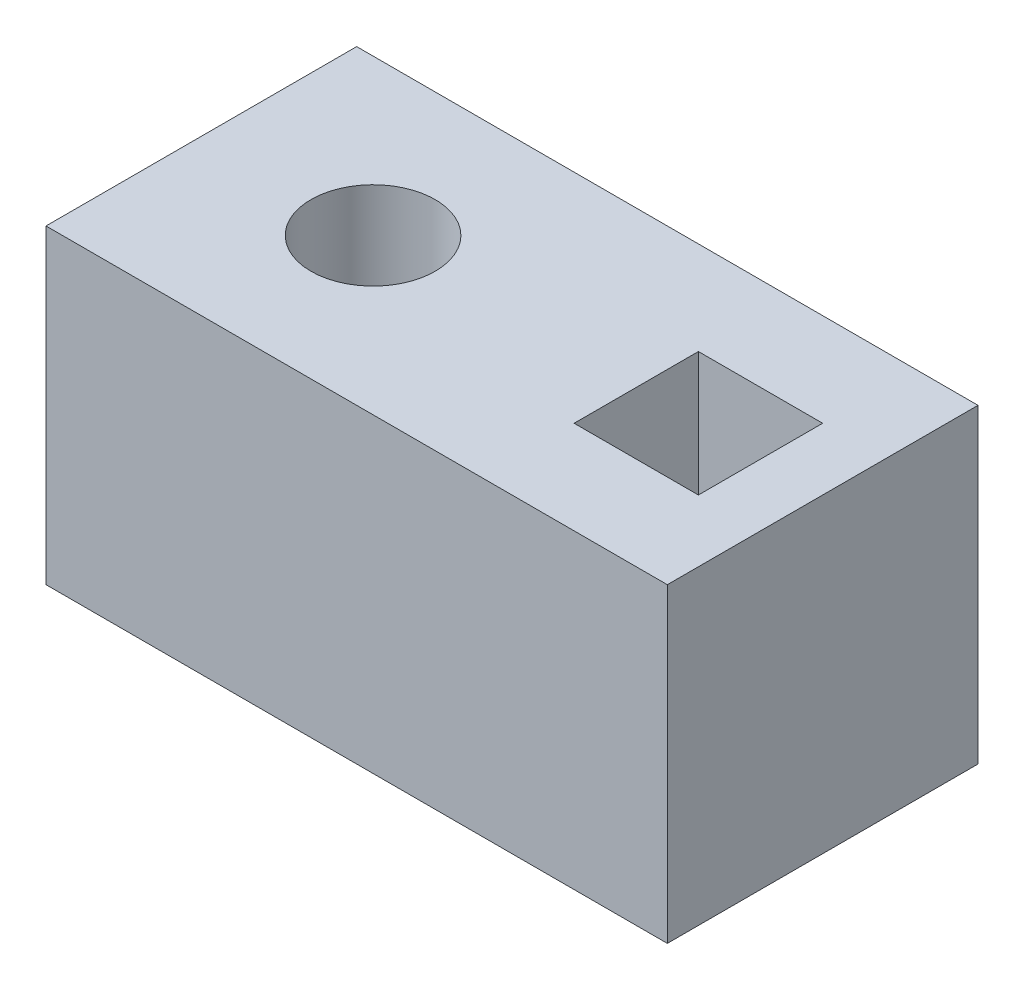
ISO-10303-21;
HEADER;
FILE_DESCRIPTION(('STEP AP214'),'2;1');
FILE_NAME('part.step','',(''),(''),'','','');
FILE_SCHEMA(('AUTOMOTIVE_DESIGN { 1 0 10303 214 1 1 1 1 }'));
ENDSEC;
DATA;
#1=APPLICATION_CONTEXT('core data for automotive mechanical design processes');
#2=APPLICATION_PROTOCOL_DEFINITION('international standard','automotive_design',2000,#1);
#3=PRODUCT_CONTEXT('',#1,'mechanical');
#4=PRODUCT('Part','Part','',(#3));
#5=PRODUCT_RELATED_PRODUCT_CATEGORY('part','',(#4));
#6=PRODUCT_DEFINITION_FORMATION('','',#4);
#7=PRODUCT_DEFINITION_CONTEXT('part definition',#1,'design');
#8=PRODUCT_DEFINITION('design','',#6,#7);
#9=PRODUCT_DEFINITION_SHAPE('','',#8);
#10=(LENGTH_UNIT() NAMED_UNIT(*) SI_UNIT(.MILLI.,.METRE.));
#11=(NAMED_UNIT(*) PLANE_ANGLE_UNIT() SI_UNIT($,.RADIAN.));
#12=(NAMED_UNIT(*) SI_UNIT($,.STERADIAN.) SOLID_ANGLE_UNIT());
#13=UNCERTAINTY_MEASURE_WITH_UNIT(LENGTH_MEASURE(1.E-05),#10,'distance_accuracy_value','');
#14=(GEOMETRIC_REPRESENTATION_CONTEXT(3) GLOBAL_UNCERTAINTY_ASSIGNED_CONTEXT((#13)) GLOBAL_UNIT_ASSIGNED_CONTEXT((#10,
#11,#12)) REPRESENTATION_CONTEXT('',''));
#15=CARTESIAN_POINT('',(0.,0.,0.));
#16=DIRECTION('',(0.,0.,1.));
#17=DIRECTION('',(1.,0.,0.));
#18=AXIS2_PLACEMENT_3D('',#15,#16,#17);
#19=CARTESIAN_POINT('',(0.,5.,0.));
#20=DIRECTION('',(0.,1.,0.));
#21=DIRECTION('',(0.,0.,1.));
#22=AXIS2_PLACEMENT_3D('',#19,#20,#21);
#23=PLANE('',#22);
#24=DIRECTION('',(0.,0.,1.));
#25=VECTOR('',#24,1.);
#26=CARTESIAN_POINT('',(-5.,5.,2.5));
#27=LINE('',#26,#25);
#28=CARTESIAN_POINT('',(-5.,5.,-2.5));
#29=VERTEX_POINT('',#28);
#30=CARTESIAN_POINT('',(-5.,5.,2.5));
#31=VERTEX_POINT('',#30);
#32=EDGE_CURVE('E161',#29,#31,#27,.T.);
#33=ORIENTED_EDGE('',*,*,#32,.T.);
#34=DIRECTION('',(1.,0.,0.));
#35=VECTOR('',#34,1.);
#36=CARTESIAN_POINT('',(5.,5.,2.5));
#37=LINE('',#36,#35);
#38=CARTESIAN_POINT('',(5.,5.,2.5));
#39=VERTEX_POINT('',#38);
#40=EDGE_CURVE('E165',#31,#39,#37,.T.);
#41=ORIENTED_EDGE('',*,*,#40,.T.);
#42=DIRECTION('',(0.,0.,-1.));
#43=VECTOR('',#42,1.);
#44=CARTESIAN_POINT('',(5.,5.,2.5));
#45=LINE('',#44,#43);
#46=CARTESIAN_POINT('',(5.,5.,-2.5));
#47=VERTEX_POINT('',#46);
#48=EDGE_CURVE('E169',#39,#47,#45,.T.);
#49=ORIENTED_EDGE('',*,*,#48,.T.);
#50=DIRECTION('',(-1.,0.,0.));
#51=VECTOR('',#50,1.);
#52=CARTESIAN_POINT('',(5.,5.,-2.5));
#53=LINE('',#52,#51);
#54=EDGE_CURVE('E172',#47,#29,#53,.T.);
#55=ORIENTED_EDGE('',*,*,#54,.T.);
#56=EDGE_LOOP('',(#33,#41,#49,#55));
#57=FACE_BOUND('',#56,.T.);
#58=CARTESIAN_POINT('',(-2.23606797749979,5.,0.));
#59=DIRECTION('',(0.,1.,0.));
#60=DIRECTION('',(0.,0.,1.));
#61=AXIS2_PLACEMENT_3D('',#58,#59,#60);
#62=CIRCLE('',#61,1.);
#63=CARTESIAN_POINT('',(-2.23606797749979,5.,1.));
#64=VERTEX_POINT('',#63);
#65=EDGE_CURVE('E153',#64,#64,#62,.T.);
#66=ORIENTED_EDGE('',*,*,#65,.F.);
#67=EDGE_LOOP('',(#66));
#68=FACE_BOUND('',#67,.T.);
#69=DIRECTION('',(1.,0.,0.));
#70=VECTOR('',#69,1.);
#71=CARTESIAN_POINT('',(4.,5.,1.));
#72=LINE('',#71,#70);
#73=CARTESIAN_POINT('',(2.,5.,1.));
#74=VERTEX_POINT('',#73);
#75=CARTESIAN_POINT('',(4.,5.,1.));
#76=VERTEX_POINT('',#75);
#77=EDGE_CURVE('E114',#74,#76,#72,.T.);
#78=ORIENTED_EDGE('',*,*,#77,.F.);
#79=DIRECTION('',(0.,0.,1.));
#80=VECTOR('',#79,1.);
#81=CARTESIAN_POINT('',(2.,5.,1.));
#82=LINE('',#81,#80);
#83=CARTESIAN_POINT('',(2.,5.,-1.));
#84=VERTEX_POINT('',#83);
#85=EDGE_CURVE('E105',#84,#74,#82,.T.);
#86=ORIENTED_EDGE('',*,*,#85,.F.);
#87=DIRECTION('',(-1.,0.,0.));
#88=VECTOR('',#87,1.);
#89=CARTESIAN_POINT('',(4.,5.,-1.));
#90=LINE('',#89,#88);
#91=CARTESIAN_POINT('',(4.,5.,-1.));
#92=VERTEX_POINT('',#91);
#93=EDGE_CURVE('E131',#92,#84,#90,.T.);
#94=ORIENTED_EDGE('',*,*,#93,.F.);
#95=DIRECTION('',(0.,0.,-1.));
#96=VECTOR('',#95,1.);
#97=CARTESIAN_POINT('',(4.,5.,1.));
#98=LINE('',#97,#96);
#99=EDGE_CURVE('E127',#76,#92,#98,.T.);
#100=ORIENTED_EDGE('',*,*,#99,.F.);
#101=EDGE_LOOP('',(#78,#86,#94,#100));
#102=FACE_BOUND('',#101,.T.);
#103=ADVANCED_FACE('F39',(#57,#68,#102),#23,.T.);
#104=CARTESIAN_POINT('',(0.,0.,0.));
#105=DIRECTION('',(0.,1.,0.));
#106=DIRECTION('',(0.,0.,1.));
#107=AXIS2_PLACEMENT_3D('',#104,#105,#106);
#108=PLANE('',#107);
#109=CARTESIAN_POINT('',(-2.23606797749979,0.,0.));
#110=DIRECTION('',(0.,1.,0.));
#111=DIRECTION('',(0.,0.,1.));
#112=AXIS2_PLACEMENT_3D('',#109,#110,#111);
#113=CIRCLE('',#112,1.);
#114=CARTESIAN_POINT('',(-2.23606797749979,0.,1.));
#115=VERTEX_POINT('',#114);
#116=EDGE_CURVE('E123',#115,#115,#113,.T.);
#117=ORIENTED_EDGE('',*,*,#116,.T.);
#118=EDGE_LOOP('',(#117));
#119=FACE_BOUND('',#118,.T.);
#120=DIRECTION('',(0.,0.,1.));
#121=VECTOR('',#120,1.);
#122=CARTESIAN_POINT('',(-5.,0.,2.5));
#123=LINE('',#122,#121);
#124=CARTESIAN_POINT('',(-5.,0.,-2.5));
#125=VERTEX_POINT('',#124);
#126=CARTESIAN_POINT('',(-5.,0.,2.5));
#127=VERTEX_POINT('',#126);
#128=EDGE_CURVE('E157',#125,#127,#123,.T.);
#129=ORIENTED_EDGE('',*,*,#128,.F.);
#130=DIRECTION('',(-1.,0.,0.));
#131=VECTOR('',#130,1.);
#132=CARTESIAN_POINT('',(5.,0.,-2.5));
#133=LINE('',#132,#131);
#134=CARTESIAN_POINT('',(5.,0.,-2.5));
#135=VERTEX_POINT('',#134);
#136=EDGE_CURVE('E166',#135,#125,#133,.T.);
#137=ORIENTED_EDGE('',*,*,#136,.F.);
#138=DIRECTION('',(0.,0.,-1.));
#139=VECTOR('',#138,1.);
#140=CARTESIAN_POINT('',(5.,0.,2.5));
#141=LINE('',#140,#139);
#142=CARTESIAN_POINT('',(5.,0.,2.5));
#143=VERTEX_POINT('',#142);
#144=EDGE_CURVE('E182',#143,#135,#141,.T.);
#145=ORIENTED_EDGE('',*,*,#144,.F.);
#146=DIRECTION('',(1.,0.,0.));
#147=VECTOR('',#146,1.);
#148=CARTESIAN_POINT('',(5.,0.,2.5));
#149=LINE('',#148,#147);
#150=EDGE_CURVE('E179',#127,#143,#149,.T.);
#151=ORIENTED_EDGE('',*,*,#150,.F.);
#152=EDGE_LOOP('',(#129,#137,#145,#151));
#153=FACE_BOUND('',#152,.T.);
#154=DIRECTION('',(0.,0.,1.));
#155=VECTOR('',#154,1.);
#156=CARTESIAN_POINT('',(2.,0.,1.));
#157=LINE('',#156,#155);
#158=CARTESIAN_POINT('',(2.,0.,-1.));
#159=VERTEX_POINT('',#158);
#160=CARTESIAN_POINT('',(2.,0.,1.));
#161=VERTEX_POINT('',#160);
#162=EDGE_CURVE('E63',#159,#161,#157,.T.);
#163=ORIENTED_EDGE('',*,*,#162,.T.);
#164=DIRECTION('',(1.,0.,0.));
#165=VECTOR('',#164,1.);
#166=CARTESIAN_POINT('',(4.,0.,1.));
#167=LINE('',#166,#165);
#168=CARTESIAN_POINT('',(4.,0.,1.));
#169=VERTEX_POINT('',#168);
#170=EDGE_CURVE('E121',#161,#169,#167,.T.);
#171=ORIENTED_EDGE('',*,*,#170,.T.);
#172=DIRECTION('',(0.,0.,-1.));
#173=VECTOR('',#172,1.);
#174=CARTESIAN_POINT('',(4.,0.,1.));
#175=LINE('',#174,#173);
#176=CARTESIAN_POINT('',(4.,0.,-1.));
#177=VERTEX_POINT('',#176);
#178=EDGE_CURVE('E140',#169,#177,#175,.T.);
#179=ORIENTED_EDGE('',*,*,#178,.T.);
#180=DIRECTION('',(-1.,0.,0.));
#181=VECTOR('',#180,1.);
#182=CARTESIAN_POINT('',(4.,0.,-1.));
#183=LINE('',#182,#181);
#184=EDGE_CURVE('E115',#177,#159,#183,.T.);
#185=ORIENTED_EDGE('',*,*,#184,.T.);
#186=EDGE_LOOP('',(#163,#171,#179,#185));
#187=FACE_BOUND('',#186,.T.);
#188=ADVANCED_FACE('F205',(#119,#153,#187),#108,.F.);
#189=CARTESIAN_POINT('',(-5.,5.,2.5));
#190=DIRECTION('',(1.,0.,0.));
#191=DIRECTION('',(0.,0.,-1.));
#192=AXIS2_PLACEMENT_3D('',#189,#190,#191);
#193=PLANE('',#192);
#194=ORIENTED_EDGE('',*,*,#128,.T.);
#195=DIRECTION('',(0.,-1.,0.));
#196=VECTOR('',#195,1.);
#197=CARTESIAN_POINT('',(-5.,5.,2.5));
#198=LINE('',#197,#196);
#199=EDGE_CURVE('E11',#31,#127,#198,.T.);
#200=ORIENTED_EDGE('',*,*,#199,.F.);
#201=ORIENTED_EDGE('',*,*,#32,.F.);
#202=DIRECTION('',(0.,-1.,0.));
#203=VECTOR('',#202,1.);
#204=CARTESIAN_POINT('',(-5.,5.,-2.5));
#205=LINE('',#204,#203);
#206=EDGE_CURVE('E175',#29,#125,#205,.T.);
#207=ORIENTED_EDGE('',*,*,#206,.T.);
#208=EDGE_LOOP('',(#194,#200,#201,#207));
#209=FACE_BOUND('',#208,.T.);
#210=ADVANCED_FACE('F41',(#209),#193,.F.);
#211=CARTESIAN_POINT('',(5.,5.,2.5));
#212=DIRECTION('',(0.,0.,-1.));
#213=DIRECTION('',(-1.,0.,0.));
#214=AXIS2_PLACEMENT_3D('',#211,#212,#213);
#215=PLANE('',#214);
#216=ORIENTED_EDGE('',*,*,#150,.T.);
#217=DIRECTION('',(0.,-1.,0.));
#218=VECTOR('',#217,1.);
#219=CARTESIAN_POINT('',(5.,5.,2.5));
#220=LINE('',#219,#218);
#221=EDGE_CURVE('E48',#39,#143,#220,.T.);
#222=ORIENTED_EDGE('',*,*,#221,.F.);
#223=ORIENTED_EDGE('',*,*,#40,.F.);
#224=ORIENTED_EDGE('',*,*,#199,.T.);
#225=EDGE_LOOP('',(#216,#222,#223,#224));
#226=FACE_BOUND('',#225,.T.);
#227=ADVANCED_FACE('F216',(#226),#215,.F.);
#228=CARTESIAN_POINT('',(5.,5.,2.5));
#229=DIRECTION('',(-1.,0.,0.));
#230=DIRECTION('',(0.,0.,1.));
#231=AXIS2_PLACEMENT_3D('',#228,#229,#230);
#232=PLANE('',#231);
#233=ORIENTED_EDGE('',*,*,#144,.T.);
#234=DIRECTION('',(0.,-1.,0.));
#235=VECTOR('',#234,1.);
#236=CARTESIAN_POINT('',(5.,5.,-2.5));
#237=LINE('',#236,#235);
#238=EDGE_CURVE('E190',#47,#135,#237,.T.);
#239=ORIENTED_EDGE('',*,*,#238,.F.);
#240=ORIENTED_EDGE('',*,*,#48,.F.);
#241=ORIENTED_EDGE('',*,*,#221,.T.);
#242=EDGE_LOOP('',(#233,#239,#240,#241));
#243=FACE_BOUND('',#242,.T.);
#244=ADVANCED_FACE('F199',(#243),#232,.F.);
#245=CARTESIAN_POINT('',(5.,5.,-2.5));
#246=DIRECTION('',(0.,0.,1.));
#247=DIRECTION('',(1.,0.,0.));
#248=AXIS2_PLACEMENT_3D('',#245,#246,#247);
#249=PLANE('',#248);
#250=ORIENTED_EDGE('',*,*,#136,.T.);
#251=ORIENTED_EDGE('',*,*,#206,.F.);
#252=ORIENTED_EDGE('',*,*,#54,.F.);
#253=ORIENTED_EDGE('',*,*,#238,.T.);
#254=EDGE_LOOP('',(#250,#251,#252,#253));
#255=FACE_BOUND('',#254,.T.);
#256=ADVANCED_FACE('F209',(#255),#249,.F.);
#257=CARTESIAN_POINT('',(-2.23606797749979,5.,0.));
#258=DIRECTION('',(0.,-1.,0.));
#259=DIRECTION('',(0.,0.,-1.));
#260=AXIS2_PLACEMENT_3D('',#257,#258,#259);
#261=CYLINDRICAL_SURFACE('',#260,1.);
#262=ORIENTED_EDGE('',*,*,#65,.T.);
#263=EDGE_LOOP('',(#262));
#264=FACE_BOUND('',#263,.T.);
#265=ORIENTED_EDGE('',*,*,#116,.F.);
#266=EDGE_LOOP('',(#265));
#267=FACE_BOUND('',#266,.T.);
#268=ADVANCED_FACE('F231',(#264,#267),#261,.F.);
#269=CARTESIAN_POINT('',(2.,5.,1.));
#270=DIRECTION('',(1.,0.,0.));
#271=DIRECTION('',(0.,0.,-1.));
#272=AXIS2_PLACEMENT_3D('',#269,#270,#271);
#273=PLANE('',#272);
#274=ORIENTED_EDGE('',*,*,#162,.F.);
#275=DIRECTION('',(0.,-1.,0.));
#276=VECTOR('',#275,1.);
#277=CARTESIAN_POINT('',(2.,5.,-1.));
#278=LINE('',#277,#276);
#279=EDGE_CURVE('E109',#84,#159,#278,.T.);
#280=ORIENTED_EDGE('',*,*,#279,.F.);
#281=ORIENTED_EDGE('',*,*,#85,.T.);
#282=DIRECTION('',(0.,-1.,0.));
#283=VECTOR('',#282,1.);
#284=CARTESIAN_POINT('',(2.,5.,1.));
#285=LINE('',#284,#283);
#286=EDGE_CURVE('E108',#74,#161,#285,.T.);
#287=ORIENTED_EDGE('',*,*,#286,.T.);
#288=EDGE_LOOP('',(#274,#280,#281,#287));
#289=FACE_BOUND('',#288,.T.);
#290=ADVANCED_FACE('F107',(#289),#273,.T.);
#291=CARTESIAN_POINT('',(4.,5.,1.));
#292=DIRECTION('',(0.,0.,-1.));
#293=DIRECTION('',(-1.,0.,0.));
#294=AXIS2_PLACEMENT_3D('',#291,#292,#293);
#295=PLANE('',#294);
#296=ORIENTED_EDGE('',*,*,#170,.F.);
#297=ORIENTED_EDGE('',*,*,#286,.F.);
#298=ORIENTED_EDGE('',*,*,#77,.T.);
#299=DIRECTION('',(0.,-1.,0.));
#300=VECTOR('',#299,1.);
#301=CARTESIAN_POINT('',(4.,5.,1.));
#302=LINE('',#301,#300);
#303=EDGE_CURVE('E124',#76,#169,#302,.T.);
#304=ORIENTED_EDGE('',*,*,#303,.T.);
#305=EDGE_LOOP('',(#296,#297,#298,#304));
#306=FACE_BOUND('',#305,.T.);
#307=ADVANCED_FACE('F118',(#306),#295,.T.);
#308=CARTESIAN_POINT('',(4.,5.,1.));
#309=DIRECTION('',(-1.,0.,0.));
#310=DIRECTION('',(0.,0.,1.));
#311=AXIS2_PLACEMENT_3D('',#308,#309,#310);
#312=PLANE('',#311);
#313=ORIENTED_EDGE('',*,*,#178,.F.);
#314=ORIENTED_EDGE('',*,*,#303,.F.);
#315=ORIENTED_EDGE('',*,*,#99,.T.);
#316=DIRECTION('',(0.,-1.,0.));
#317=VECTOR('',#316,1.);
#318=CARTESIAN_POINT('',(4.,5.,-1.));
#319=LINE('',#318,#317);
#320=EDGE_CURVE('E55',#92,#177,#319,.T.);
#321=ORIENTED_EDGE('',*,*,#320,.T.);
#322=EDGE_LOOP('',(#313,#314,#315,#321));
#323=FACE_BOUND('',#322,.T.);
#324=ADVANCED_FACE('F248',(#323),#312,.T.);
#325=CARTESIAN_POINT('',(4.,5.,-1.));
#326=DIRECTION('',(0.,0.,1.));
#327=DIRECTION('',(1.,0.,0.));
#328=AXIS2_PLACEMENT_3D('',#325,#326,#327);
#329=PLANE('',#328);
#330=ORIENTED_EDGE('',*,*,#184,.F.);
#331=ORIENTED_EDGE('',*,*,#320,.F.);
#332=ORIENTED_EDGE('',*,*,#93,.T.);
#333=ORIENTED_EDGE('',*,*,#279,.T.);
#334=EDGE_LOOP('',(#330,#331,#332,#333));
#335=FACE_BOUND('',#334,.T.);
#336=ADVANCED_FACE('F253',(#335),#329,.T.);
#337=CLOSED_SHELL('',(#103,#188,#210,#227,#244,#256,#268,#290,#307,#324,#336));
#338=MANIFOLD_SOLID_BREP('B2',#337);
#339=ADVANCED_BREP_SHAPE_REPRESENTATION('',(#18,#338),#14);
#340=SHAPE_DEFINITION_REPRESENTATION(#9,#339);
ENDSEC;
END-ISO-10303-21;
